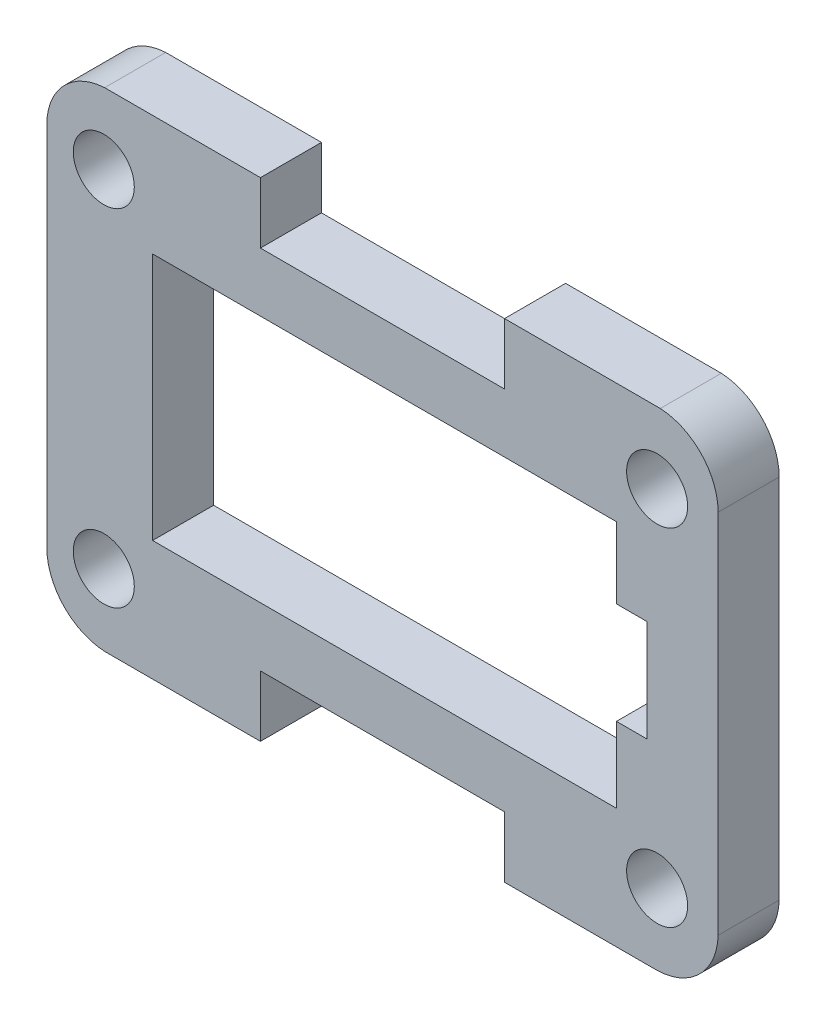
ISO-10303-21;
HEADER;
FILE_DESCRIPTION(('STEP AP214'),'2;1');
FILE_NAME('part.step','',(''),(''),'','','');
FILE_SCHEMA(('AUTOMOTIVE_DESIGN { 1 0 10303 214 1 1 1 1 }'));
ENDSEC;
DATA;
#1=APPLICATION_CONTEXT('core data for automotive mechanical design processes');
#2=APPLICATION_PROTOCOL_DEFINITION('international standard','automotive_design',2000,#1);
#3=PRODUCT_CONTEXT('',#1,'mechanical');
#4=PRODUCT('Part','Part','',(#3));
#5=PRODUCT_RELATED_PRODUCT_CATEGORY('part','',(#4));
#6=PRODUCT_DEFINITION_FORMATION('','',#4);
#7=PRODUCT_DEFINITION_CONTEXT('part definition',#1,'design');
#8=PRODUCT_DEFINITION('design','',#6,#7);
#9=PRODUCT_DEFINITION_SHAPE('','',#8);
#10=(LENGTH_UNIT() NAMED_UNIT(*) SI_UNIT(.MILLI.,.METRE.));
#11=(NAMED_UNIT(*) PLANE_ANGLE_UNIT() SI_UNIT($,.RADIAN.));
#12=(NAMED_UNIT(*) SI_UNIT($,.STERADIAN.) SOLID_ANGLE_UNIT());
#13=UNCERTAINTY_MEASURE_WITH_UNIT(LENGTH_MEASURE(1.E-05),#10,'distance_accuracy_value','');
#14=(GEOMETRIC_REPRESENTATION_CONTEXT(3) GLOBAL_UNCERTAINTY_ASSIGNED_CONTEXT((#13)) GLOBAL_UNIT_ASSIGNED_CONTEXT((#10,
#11,#12)) REPRESENTATION_CONTEXT('',''));
#15=CARTESIAN_POINT('',(0.,0.,0.));
#16=DIRECTION('',(0.,0.,1.));
#17=DIRECTION('',(1.,0.,0.));
#18=AXIS2_PLACEMENT_3D('',#15,#16,#17);
#19=CARTESIAN_POINT('',(207.000237796486,84.9905567618648,3.));
#20=DIRECTION('',(0.,0.,1.));
#21=DIRECTION('',(1.,0.,0.));
#22=AXIS2_PLACEMENT_3D('',#19,#20,#21);
#23=PLANE('',#22);
#24=CARTESIAN_POINT('',(207.000112679908,84.4865165778574,3.));
#25=DIRECTION('',(0.,0.,1.));
#26=DIRECTION('',(1.,0.,0.));
#27=AXIS2_PLACEMENT_3D('',#24,#25,#26);
#28=CIRCLE('',#27,1.50000000833417);
#29=CARTESIAN_POINT('',(208.500112688243,84.4865165778574,3.));
#30=VERTEX_POINT('',#29);
#31=EDGE_CURVE('E722',#30,#30,#28,.T.);
#32=ORIENTED_EDGE('',*,*,#31,.F.);
#33=EDGE_LOOP('',(#32));
#34=FACE_BOUND('',#33,.T.);
#35=CARTESIAN_POINT('',(179.800012686101,67.4865165678567,3.));
#36=DIRECTION('',(0.,0.,1.));
#37=DIRECTION('',(1.,0.,0.));
#38=AXIS2_PLACEMENT_3D('',#35,#36,#37);
#39=CIRCLE('',#38,1.50000000166674);
#40=CARTESIAN_POINT('',(181.300012687767,67.4865165678567,3.));
#41=VERTEX_POINT('',#40);
#42=EDGE_CURVE('E232',#41,#41,#39,.T.);
#43=ORIENTED_EDGE('',*,*,#42,.F.);
#44=EDGE_LOOP('',(#43));
#45=FACE_BOUND('',#44,.T.);
#46=DIRECTION('',(-1.,0.,0.));
#47=VECTOR('',#46,1.);
#48=CARTESIAN_POINT('',(199.500112684434,87.9863165695235,3.));
#49=LINE('',#48,#47);
#50=CARTESIAN_POINT('',(207.157312684549,87.9863165695236,3.));
#51=VERTEX_POINT('',#50);
#52=CARTESIAN_POINT('',(199.500112684434,87.9863165695235,3.));
#53=VERTEX_POINT('',#52);
#54=EDGE_CURVE('E262',#51,#53,#49,.T.);
#55=ORIENTED_EDGE('',*,*,#54,.T.);
#56=DIRECTION('',(0.,-1.,0.));
#57=VECTOR('',#56,1.);
#58=CARTESIAN_POINT('',(199.500112684434,87.9863165695235,3.));
#59=LINE('',#58,#57);
#60=CARTESIAN_POINT('',(199.500112684434,84.9865165695234,3.));
#61=VERTEX_POINT('',#60);
#62=EDGE_CURVE('E265',#53,#61,#59,.T.);
#63=ORIENTED_EDGE('',*,*,#62,.T.);
#64=DIRECTION('',(-1.,0.,0.));
#65=VECTOR('',#64,1.);
#66=CARTESIAN_POINT('',(199.500112684434,84.9865165695234,3.));
#67=LINE('',#66,#65);
#68=CARTESIAN_POINT('',(187.500112684433,84.9865165695234,3.));
#69=VERTEX_POINT('',#68);
#70=EDGE_CURVE('E268',#61,#69,#67,.T.);
#71=ORIENTED_EDGE('',*,*,#70,.T.);
#72=DIRECTION('',(0.,1.,0.));
#73=VECTOR('',#72,1.);
#74=CARTESIAN_POINT('',(187.500112684433,84.9865165695234,3.));
#75=LINE('',#74,#73);
#76=CARTESIAN_POINT('',(187.500112684433,87.9863165695235,3.));
#77=VERTEX_POINT('',#76);
#78=EDGE_CURVE('E270',#69,#77,#75,.T.);
#79=ORIENTED_EDGE('',*,*,#78,.T.);
#80=DIRECTION('',(-1.,0.,0.));
#81=VECTOR('',#80,1.);
#82=CARTESIAN_POINT('',(187.500112684433,87.9863165695235,3.));
#83=LINE('',#82,#81);
#84=CARTESIAN_POINT('',(179.842912684433,87.9863165695236,3.));
#85=VERTEX_POINT('',#84);
#86=EDGE_CURVE('E272',#77,#85,#83,.T.);
#87=ORIENTED_EDGE('',*,*,#86,.T.);
#88=CARTESIAN_POINT('',(179.999987572496,84.9905567618648,3.));
#89=DIRECTION('',(0.,0.,1.));
#90=DIRECTION('',(1.,0.,0.));
#91=AXIS2_PLACEMENT_3D('',#88,#89,#90);
#92=CIRCLE('',#91,2.99987488833178);
#93=CARTESIAN_POINT('',(177.000112684434,84.9905165695236,3.));
#94=VERTEX_POINT('',#93);
#95=EDGE_CURVE('E274',#85,#94,#92,.T.);
#96=ORIENTED_EDGE('',*,*,#95,.T.);
#97=DIRECTION('',(0.,-1.,0.));
#98=VECTOR('',#97,1.);
#99=CARTESIAN_POINT('',(177.000112684434,66.9823165695233,3.));
#100=LINE('',#99,#98);
#101=CARTESIAN_POINT('',(177.000112684434,66.9823165695233,3.));
#102=VERTEX_POINT('',#101);
#103=EDGE_CURVE('E276',#94,#102,#100,.T.);
#104=ORIENTED_EDGE('',*,*,#103,.T.);
#105=CARTESIAN_POINT('',(179.999987572497,66.9822763771822,3.));
#106=DIRECTION('',(0.,0.,1.));
#107=DIRECTION('',(1.,0.,0.));
#108=AXIS2_PLACEMENT_3D('',#105,#106,#107);
#109=CIRCLE('',#108,2.99987488833185);
#110=CARTESIAN_POINT('',(179.842912684434,63.9865165695234,3.));
#111=VERTEX_POINT('',#110);
#112=EDGE_CURVE('E278',#102,#111,#109,.T.);
#113=ORIENTED_EDGE('',*,*,#112,.T.);
#114=DIRECTION('',(1.,0.,0.));
#115=VECTOR('',#114,1.);
#116=CARTESIAN_POINT('',(187.500112684433,63.9865165695234,3.));
#117=LINE('',#116,#115);
#118=CARTESIAN_POINT('',(187.500112684433,63.9865165695234,3.));
#119=VERTEX_POINT('',#118);
#120=EDGE_CURVE('E280',#111,#119,#117,.T.);
#121=ORIENTED_EDGE('',*,*,#120,.T.);
#122=DIRECTION('',(0.,1.,0.));
#123=VECTOR('',#122,1.);
#124=CARTESIAN_POINT('',(187.500112684433,66.9865165695235,3.));
#125=LINE('',#124,#123);
#126=CARTESIAN_POINT('',(187.500112684433,66.9865165695235,3.));
#127=VERTEX_POINT('',#126);
#128=EDGE_CURVE('E282',#119,#127,#125,.T.);
#129=ORIENTED_EDGE('',*,*,#128,.T.);
#130=DIRECTION('',(1.,0.,0.));
#131=VECTOR('',#130,1.);
#132=CARTESIAN_POINT('',(199.500112684434,66.9865165695235,3.));
#133=LINE('',#132,#131);
#134=CARTESIAN_POINT('',(199.500112684434,66.9865165695235,3.));
#135=VERTEX_POINT('',#134);
#136=EDGE_CURVE('E284',#127,#135,#133,.T.);
#137=ORIENTED_EDGE('',*,*,#136,.T.);
#138=DIRECTION('',(1.66533453693769E-13,-1.,0.));
#139=VECTOR('',#138,1.);
#140=CARTESIAN_POINT('',(199.500112684434,63.9865165695234,3.));
#141=LINE('',#140,#139);
#142=CARTESIAN_POINT('',(199.500112684434,63.9865165695234,3.));
#143=VERTEX_POINT('',#142);
#144=EDGE_CURVE('E286',#135,#143,#141,.T.);
#145=ORIENTED_EDGE('',*,*,#144,.T.);
#146=DIRECTION('',(1.,0.,0.));
#147=VECTOR('',#146,1.);
#148=CARTESIAN_POINT('',(199.500112684434,63.9865165695234,3.));
#149=LINE('',#148,#147);
#150=CARTESIAN_POINT('',(207.000112684425,63.9865165695234,3.));
#151=VERTEX_POINT('',#150);
#152=EDGE_CURVE('E288',#143,#151,#149,.T.);
#153=ORIENTED_EDGE('',*,*,#152,.T.);
#154=CARTESIAN_POINT('',(206.921637796367,67.065104420582,3.));
#155=DIRECTION('',(0.,0.,1.));
#156=DIRECTION('',(1.,0.,0.));
#157=AXIS2_PLACEMENT_3D('',#154,#155,#156);
#158=CIRCLE('',#157,3.07958787254749);
#159=CARTESIAN_POINT('',(210.000112684434,66.9823165695234,3.));
#160=VERTEX_POINT('',#159);
#161=EDGE_CURVE('E290',#151,#160,#158,.T.);
#162=ORIENTED_EDGE('',*,*,#161,.T.);
#163=DIRECTION('',(6.36854535399307E-12,1.,0.));
#164=VECTOR('',#163,1.);
#165=CARTESIAN_POINT('',(210.000112684549,84.9905165695235,3.));
#166=LINE('',#165,#164);
#167=CARTESIAN_POINT('',(210.000112684549,84.9905165695235,3.));
#168=VERTEX_POINT('',#167);
#169=EDGE_CURVE('E292',#160,#168,#166,.T.);
#170=ORIENTED_EDGE('',*,*,#169,.T.);
#171=CARTESIAN_POINT('',(207.000237796486,84.9905567618648,3.));
#172=DIRECTION('',(0.,0.,1.));
#173=DIRECTION('',(1.,0.,0.));
#174=AXIS2_PLACEMENT_3D('',#171,#172,#173);
#175=CIRCLE('',#174,2.99987488833178);
#176=EDGE_CURVE('E294',#168,#51,#175,.T.);
#177=ORIENTED_EDGE('',*,*,#176,.T.);
#178=EDGE_LOOP('',(#55,#63,#71,#79,#87,#96,#104,#113,#121,#129,#137,#145,#153,#162,#170,#177));
#179=FACE_BOUND('',#178,.T.);
#180=DIRECTION('',(0.,1.,0.));
#181=VECTOR('',#180,1.);
#182=CARTESIAN_POINT('',(206.500112684434,78.5885165779574,3.));
#183=LINE('',#182,#181);
#184=CARTESIAN_POINT('',(206.500112684434,73.5885165779573,3.));
#185=VERTEX_POINT('',#184);
#186=CARTESIAN_POINT('',(206.500112684434,78.5885165779574,3.));
#187=VERTEX_POINT('',#186);
#188=EDGE_CURVE('E202',#185,#187,#183,.T.);
#189=ORIENTED_EDGE('',*,*,#188,.F.);
#190=DIRECTION('',(1.,0.,0.));
#191=VECTOR('',#190,1.);
#192=CARTESIAN_POINT('',(206.500112684434,73.5885165779573,3.));
#193=LINE('',#192,#191);
#194=CARTESIAN_POINT('',(205.000112684434,73.5885165779573,3.));
#195=VERTEX_POINT('',#194);
#196=EDGE_CURVE('E194',#195,#185,#193,.T.);
#197=ORIENTED_EDGE('',*,*,#196,.F.);
#198=DIRECTION('',(0.,1.,0.));
#199=VECTOR('',#198,1.);
#200=CARTESIAN_POINT('',(205.000112684434,73.5885165779573,3.));
#201=LINE('',#200,#199);
#202=CARTESIAN_POINT('',(205.000112684434,69.8885165779574,3.));
#203=VERTEX_POINT('',#202);
#204=EDGE_CURVE('E229',#203,#195,#201,.T.);
#205=ORIENTED_EDGE('',*,*,#204,.F.);
#206=DIRECTION('',(1.,0.,0.));
#207=VECTOR('',#206,1.);
#208=CARTESIAN_POINT('',(205.000112684434,69.8885165779574,3.));
#209=LINE('',#208,#207);
#210=CARTESIAN_POINT('',(182.200112684433,69.8885165779574,3.));
#211=VERTEX_POINT('',#210);
#212=EDGE_CURVE('E227',#211,#203,#209,.T.);
#213=ORIENTED_EDGE('',*,*,#212,.F.);
#214=DIRECTION('',(0.,-1.,0.));
#215=VECTOR('',#214,1.);
#216=CARTESIAN_POINT('',(182.200112684433,69.8885165779574,3.));
#217=LINE('',#216,#215);
#218=CARTESIAN_POINT('',(182.200112684433,82.0885165779572,3.));
#219=VERTEX_POINT('',#218);
#220=EDGE_CURVE('E225',#219,#211,#217,.T.);
#221=ORIENTED_EDGE('',*,*,#220,.F.);
#222=DIRECTION('',(-1.,0.,0.));
#223=VECTOR('',#222,1.);
#224=CARTESIAN_POINT('',(182.200112684433,82.0885165779572,3.));
#225=LINE('',#224,#223);
#226=CARTESIAN_POINT('',(205.000112684434,82.0885165779572,3.));
#227=VERTEX_POINT('',#226);
#228=EDGE_CURVE('E223',#227,#219,#225,.T.);
#229=ORIENTED_EDGE('',*,*,#228,.F.);
#230=DIRECTION('',(0.,1.,0.));
#231=VECTOR('',#230,1.);
#232=CARTESIAN_POINT('',(205.000112684434,82.0885165779572,3.));
#233=LINE('',#232,#231);
#234=CARTESIAN_POINT('',(205.000112684434,78.5885165779574,3.));
#235=VERTEX_POINT('',#234);
#236=EDGE_CURVE('E218',#235,#227,#233,.T.);
#237=ORIENTED_EDGE('',*,*,#236,.F.);
#238=DIRECTION('',(-1.,0.,0.));
#239=VECTOR('',#238,1.);
#240=CARTESIAN_POINT('',(205.000112684434,78.5885165779574,3.));
#241=LINE('',#240,#239);
#242=EDGE_CURVE('E216',#187,#235,#241,.T.);
#243=ORIENTED_EDGE('',*,*,#242,.F.);
#244=EDGE_LOOP('',(#189,#197,#205,#213,#221,#229,#237,#243));
#245=FACE_BOUND('',#244,.T.);
#246=CARTESIAN_POINT('',(179.800062677767,84.4865665828579,3.));
#247=DIRECTION('',(0.,0.,1.));
#248=DIRECTION('',(1.,0.,0.));
#249=AXIS2_PLACEMENT_3D('',#246,#247,#248);
#250=CIRCLE('',#249,1.50000000000003);
#251=CARTESIAN_POINT('',(181.300062677767,84.4865665828579,3.));
#252=VERTEX_POINT('',#251);
#253=EDGE_CURVE('E728',#252,#252,#250,.T.);
#254=ORIENTED_EDGE('',*,*,#253,.F.);
#255=EDGE_LOOP('',(#254));
#256=FACE_BOUND('',#255,.T.);
#257=CARTESIAN_POINT('',(207.000062687767,67.4864665728567,3.));
#258=DIRECTION('',(0.,0.,1.));
#259=DIRECTION('',(1.,0.,0.));
#260=AXIS2_PLACEMENT_3D('',#257,#258,#259);
#261=CIRCLE('',#260,1.5);
#262=CARTESIAN_POINT('',(208.500062687767,67.4864665728567,3.));
#263=VERTEX_POINT('',#262);
#264=EDGE_CURVE('E713',#263,#263,#261,.T.);
#265=ORIENTED_EDGE('',*,*,#264,.F.);
#266=EDGE_LOOP('',(#265));
#267=FACE_BOUND('',#266,.T.);
#268=ADVANCED_FACE('F33',(#34,#45,#179,#245,#256,#267),#23,.T.);
#269=CARTESIAN_POINT('',(207.000237796486,84.9905567618648,0.));
#270=DIRECTION('',(0.,0.,1.));
#271=DIRECTION('',(1.,0.,0.));
#272=AXIS2_PLACEMENT_3D('',#269,#270,#271);
#273=PLANE('',#272);
#274=DIRECTION('',(-1.,0.,0.));
#275=VECTOR('',#274,1.);
#276=CARTESIAN_POINT('',(199.500112684434,87.9863165695235,0.));
#277=LINE('',#276,#275);
#278=CARTESIAN_POINT('',(207.157312684549,87.9863165695236,0.));
#279=VERTEX_POINT('',#278);
#280=CARTESIAN_POINT('',(199.500112684434,87.9863165695235,0.));
#281=VERTEX_POINT('',#280);
#282=EDGE_CURVE('E210',#279,#281,#277,.T.);
#283=ORIENTED_EDGE('',*,*,#282,.F.);
#284=CARTESIAN_POINT('',(207.000237796486,84.9905567618648,0.));
#285=DIRECTION('',(0.,0.,1.));
#286=DIRECTION('',(1.,0.,0.));
#287=AXIS2_PLACEMENT_3D('',#284,#285,#286);
#288=CIRCLE('',#287,2.99987488833178);
#289=CARTESIAN_POINT('',(210.000112684549,84.9905165695235,0.));
#290=VERTEX_POINT('',#289);
#291=EDGE_CURVE('E266',#290,#279,#288,.T.);
#292=ORIENTED_EDGE('',*,*,#291,.F.);
#293=DIRECTION('',(6.36854535399307E-12,1.,0.));
#294=VECTOR('',#293,1.);
#295=CARTESIAN_POINT('',(210.000112684549,84.9905165695235,0.));
#296=LINE('',#295,#294);
#297=CARTESIAN_POINT('',(210.000112684434,66.9823165695234,0.));
#298=VERTEX_POINT('',#297);
#299=EDGE_CURVE('E325',#298,#290,#296,.T.);
#300=ORIENTED_EDGE('',*,*,#299,.F.);
#301=CARTESIAN_POINT('',(206.921637796367,67.065104420582,0.));
#302=DIRECTION('',(0.,0.,1.));
#303=DIRECTION('',(1.,0.,0.));
#304=AXIS2_PLACEMENT_3D('',#301,#302,#303);
#305=CIRCLE('',#304,3.07958787254749);
#306=CARTESIAN_POINT('',(207.000112684425,63.9865165695234,0.));
#307=VERTEX_POINT('',#306);
#308=EDGE_CURVE('E323',#307,#298,#305,.T.);
#309=ORIENTED_EDGE('',*,*,#308,.F.);
#310=DIRECTION('',(1.,0.,0.));
#311=VECTOR('',#310,1.);
#312=CARTESIAN_POINT('',(199.500112684434,63.9865165695234,0.));
#313=LINE('',#312,#311);
#314=CARTESIAN_POINT('',(199.500112684434,63.9865165695234,0.));
#315=VERTEX_POINT('',#314);
#316=EDGE_CURVE('E321',#315,#307,#313,.T.);
#317=ORIENTED_EDGE('',*,*,#316,.F.);
#318=DIRECTION('',(1.66533453693769E-13,-1.,0.));
#319=VECTOR('',#318,1.);
#320=CARTESIAN_POINT('',(199.500112684434,63.9865165695234,0.));
#321=LINE('',#320,#319);
#322=CARTESIAN_POINT('',(199.500112684434,66.9865165695235,0.));
#323=VERTEX_POINT('',#322);
#324=EDGE_CURVE('E319',#323,#315,#321,.T.);
#325=ORIENTED_EDGE('',*,*,#324,.F.);
#326=DIRECTION('',(1.,0.,0.));
#327=VECTOR('',#326,1.);
#328=CARTESIAN_POINT('',(199.500112684434,66.9865165695235,0.));
#329=LINE('',#328,#327);
#330=CARTESIAN_POINT('',(187.500112684433,66.9865165695235,0.));
#331=VERTEX_POINT('',#330);
#332=EDGE_CURVE('E317',#331,#323,#329,.T.);
#333=ORIENTED_EDGE('',*,*,#332,.F.);
#334=DIRECTION('',(0.,1.,0.));
#335=VECTOR('',#334,1.);
#336=CARTESIAN_POINT('',(187.500112684433,66.9865165695235,0.));
#337=LINE('',#336,#335);
#338=CARTESIAN_POINT('',(187.500112684433,63.9865165695234,0.));
#339=VERTEX_POINT('',#338);
#340=EDGE_CURVE('E315',#339,#331,#337,.T.);
#341=ORIENTED_EDGE('',*,*,#340,.F.);
#342=DIRECTION('',(1.,0.,0.));
#343=VECTOR('',#342,1.);
#344=CARTESIAN_POINT('',(187.500112684433,63.9865165695234,0.));
#345=LINE('',#344,#343);
#346=CARTESIAN_POINT('',(179.842912684434,63.9865165695234,0.));
#347=VERTEX_POINT('',#346);
#348=EDGE_CURVE('E313',#347,#339,#345,.T.);
#349=ORIENTED_EDGE('',*,*,#348,.F.);
#350=CARTESIAN_POINT('',(179.999987572497,66.9822763771822,0.));
#351=DIRECTION('',(0.,0.,1.));
#352=DIRECTION('',(1.,0.,0.));
#353=AXIS2_PLACEMENT_3D('',#350,#351,#352);
#354=CIRCLE('',#353,2.99987488833185);
#355=CARTESIAN_POINT('',(177.000112684434,66.9823165695233,0.));
#356=VERTEX_POINT('',#355);
#357=EDGE_CURVE('E311',#356,#347,#354,.T.);
#358=ORIENTED_EDGE('',*,*,#357,.F.);
#359=DIRECTION('',(0.,-1.,0.));
#360=VECTOR('',#359,1.);
#361=CARTESIAN_POINT('',(177.000112684434,66.9823165695233,0.));
#362=LINE('',#361,#360);
#363=CARTESIAN_POINT('',(177.000112684434,84.9905165695236,0.));
#364=VERTEX_POINT('',#363);
#365=EDGE_CURVE('E309',#364,#356,#362,.T.);
#366=ORIENTED_EDGE('',*,*,#365,.F.);
#367=CARTESIAN_POINT('',(179.999987572496,84.9905567618648,0.));
#368=DIRECTION('',(0.,0.,1.));
#369=DIRECTION('',(1.,0.,0.));
#370=AXIS2_PLACEMENT_3D('',#367,#368,#369);
#371=CIRCLE('',#370,2.99987488833178);
#372=CARTESIAN_POINT('',(179.842912684433,87.9863165695236,0.));
#373=VERTEX_POINT('',#372);
#374=EDGE_CURVE('E307',#373,#364,#371,.T.);
#375=ORIENTED_EDGE('',*,*,#374,.F.);
#376=DIRECTION('',(-1.,0.,0.));
#377=VECTOR('',#376,1.);
#378=CARTESIAN_POINT('',(187.500112684433,87.9863165695235,0.));
#379=LINE('',#378,#377);
#380=CARTESIAN_POINT('',(187.500112684433,87.9863165695235,0.));
#381=VERTEX_POINT('',#380);
#382=EDGE_CURVE('E305',#381,#373,#379,.T.);
#383=ORIENTED_EDGE('',*,*,#382,.F.);
#384=DIRECTION('',(0.,1.,0.));
#385=VECTOR('',#384,1.);
#386=CARTESIAN_POINT('',(187.500112684433,84.9865165695234,0.));
#387=LINE('',#386,#385);
#388=CARTESIAN_POINT('',(187.500112684433,84.9865165695234,0.));
#389=VERTEX_POINT('',#388);
#390=EDGE_CURVE('E303',#389,#381,#387,.T.);
#391=ORIENTED_EDGE('',*,*,#390,.F.);
#392=DIRECTION('',(-1.,0.,0.));
#393=VECTOR('',#392,1.);
#394=CARTESIAN_POINT('',(199.500112684434,84.9865165695234,0.));
#395=LINE('',#394,#393);
#396=CARTESIAN_POINT('',(199.500112684434,84.9865165695234,0.));
#397=VERTEX_POINT('',#396);
#398=EDGE_CURVE('E301',#397,#389,#395,.T.);
#399=ORIENTED_EDGE('',*,*,#398,.F.);
#400=DIRECTION('',(0.,-1.,0.));
#401=VECTOR('',#400,1.);
#402=CARTESIAN_POINT('',(199.500112684434,87.9863165695235,0.));
#403=LINE('',#402,#401);
#404=EDGE_CURVE('E299',#281,#397,#403,.T.);
#405=ORIENTED_EDGE('',*,*,#404,.F.);
#406=EDGE_LOOP('',(#283,#292,#300,#309,#317,#325,#333,#341,#349,#358,#366,#375,#383,#391,#399,#405));
#407=FACE_BOUND('',#406,.T.);
#408=DIRECTION('',(1.,0.,0.));
#409=VECTOR('',#408,1.);
#410=CARTESIAN_POINT('',(206.500112684434,73.5885165779573,0.));
#411=LINE('',#410,#409);
#412=CARTESIAN_POINT('',(205.000112684434,73.5885165779573,0.));
#413=VERTEX_POINT('',#412);
#414=CARTESIAN_POINT('',(206.500112684434,73.5885165779573,0.));
#415=VERTEX_POINT('',#414);
#416=EDGE_CURVE('E56',#413,#415,#411,.T.);
#417=ORIENTED_EDGE('',*,*,#416,.T.);
#418=DIRECTION('',(0.,1.,0.));
#419=VECTOR('',#418,1.);
#420=CARTESIAN_POINT('',(206.500112684434,78.5885165779574,0.));
#421=LINE('',#420,#419);
#422=CARTESIAN_POINT('',(206.500112684434,78.5885165779574,0.));
#423=VERTEX_POINT('',#422);
#424=EDGE_CURVE('E209',#415,#423,#421,.T.);
#425=ORIENTED_EDGE('',*,*,#424,.T.);
#426=DIRECTION('',(-1.,0.,0.));
#427=VECTOR('',#426,1.);
#428=CARTESIAN_POINT('',(205.000112684434,78.5885165779574,0.));
#429=LINE('',#428,#427);
#430=CARTESIAN_POINT('',(205.000112684434,78.5885165779574,0.));
#431=VERTEX_POINT('',#430);
#432=EDGE_CURVE('E234',#423,#431,#429,.T.);
#433=ORIENTED_EDGE('',*,*,#432,.T.);
#434=DIRECTION('',(0.,1.,0.));
#435=VECTOR('',#434,1.);
#436=CARTESIAN_POINT('',(205.000112684434,82.0885165779572,0.));
#437=LINE('',#436,#435);
#438=CARTESIAN_POINT('',(205.000112684434,82.0885165779572,0.));
#439=VERTEX_POINT('',#438);
#440=EDGE_CURVE('E237',#431,#439,#437,.T.);
#441=ORIENTED_EDGE('',*,*,#440,.T.);
#442=DIRECTION('',(-1.,0.,0.));
#443=VECTOR('',#442,1.);
#444=CARTESIAN_POINT('',(182.200112684433,82.0885165779572,0.));
#445=LINE('',#444,#443);
#446=CARTESIAN_POINT('',(182.200112684433,82.0885165779572,0.));
#447=VERTEX_POINT('',#446);
#448=EDGE_CURVE('E240',#439,#447,#445,.T.);
#449=ORIENTED_EDGE('',*,*,#448,.T.);
#450=DIRECTION('',(0.,-1.,0.));
#451=VECTOR('',#450,1.);
#452=CARTESIAN_POINT('',(182.200112684433,69.8885165779574,0.));
#453=LINE('',#452,#451);
#454=CARTESIAN_POINT('',(182.200112684433,69.8885165779574,0.));
#455=VERTEX_POINT('',#454);
#456=EDGE_CURVE('E243',#447,#455,#453,.T.);
#457=ORIENTED_EDGE('',*,*,#456,.T.);
#458=DIRECTION('',(1.,0.,0.));
#459=VECTOR('',#458,1.);
#460=CARTESIAN_POINT('',(205.000112684434,69.8885165779574,0.));
#461=LINE('',#460,#459);
#462=CARTESIAN_POINT('',(205.000112684434,69.8885165779574,0.));
#463=VERTEX_POINT('',#462);
#464=EDGE_CURVE('E246',#455,#463,#461,.T.);
#465=ORIENTED_EDGE('',*,*,#464,.T.);
#466=DIRECTION('',(0.,1.,0.));
#467=VECTOR('',#466,1.);
#468=CARTESIAN_POINT('',(205.000112684434,73.5885165779573,0.));
#469=LINE('',#468,#467);
#470=EDGE_CURVE('E203',#463,#413,#469,.T.);
#471=ORIENTED_EDGE('',*,*,#470,.T.);
#472=EDGE_LOOP('',(#417,#425,#433,#441,#449,#457,#465,#471));
#473=FACE_BOUND('',#472,.T.);
#474=CARTESIAN_POINT('',(179.800012686101,67.4865165678567,0.));
#475=DIRECTION('',(0.,0.,1.));
#476=DIRECTION('',(1.,0.,0.));
#477=AXIS2_PLACEMENT_3D('',#474,#475,#476);
#478=CIRCLE('',#477,1.50000000166674);
#479=CARTESIAN_POINT('',(181.300012687767,67.4865165678567,0.));
#480=VERTEX_POINT('',#479);
#481=EDGE_CURVE('E731',#480,#480,#478,.T.);
#482=ORIENTED_EDGE('',*,*,#481,.T.);
#483=EDGE_LOOP('',(#482));
#484=FACE_BOUND('',#483,.T.);
#485=CARTESIAN_POINT('',(179.800062677767,84.4865665828579,0.));
#486=DIRECTION('',(0.,0.,1.));
#487=DIRECTION('',(1.,0.,0.));
#488=AXIS2_PLACEMENT_3D('',#485,#486,#487);
#489=CIRCLE('',#488,1.50000000000003);
#490=CARTESIAN_POINT('',(181.300062677767,84.4865665828579,0.));
#491=VERTEX_POINT('',#490);
#492=EDGE_CURVE('E725',#491,#491,#489,.T.);
#493=ORIENTED_EDGE('',*,*,#492,.T.);
#494=EDGE_LOOP('',(#493));
#495=FACE_BOUND('',#494,.T.);
#496=CARTESIAN_POINT('',(207.000112679908,84.4865165778574,0.));
#497=DIRECTION('',(0.,0.,1.));
#498=DIRECTION('',(1.,0.,0.));
#499=AXIS2_PLACEMENT_3D('',#496,#497,#498);
#500=CIRCLE('',#499,1.50000000833417);
#501=CARTESIAN_POINT('',(208.500112688243,84.4865165778574,0.));
#502=VERTEX_POINT('',#501);
#503=EDGE_CURVE('E719',#502,#502,#500,.T.);
#504=ORIENTED_EDGE('',*,*,#503,.T.);
#505=EDGE_LOOP('',(#504));
#506=FACE_BOUND('',#505,.T.);
#507=CARTESIAN_POINT('',(207.000062687767,67.4864665728567,0.));
#508=DIRECTION('',(0.,0.,1.));
#509=DIRECTION('',(1.,0.,0.));
#510=AXIS2_PLACEMENT_3D('',#507,#508,#509);
#511=CIRCLE('',#510,1.5);
#512=CARTESIAN_POINT('',(208.500062687767,67.4864665728567,0.));
#513=VERTEX_POINT('',#512);
#514=EDGE_CURVE('E716',#513,#513,#511,.T.);
#515=ORIENTED_EDGE('',*,*,#514,.T.);
#516=EDGE_LOOP('',(#515));
#517=FACE_BOUND('',#516,.T.);
#518=ADVANCED_FACE('F379',(#407,#473,#484,#495,#506,#517),#273,.F.);
#519=CARTESIAN_POINT('',(199.500112684434,87.9863165695235,3.));
#520=DIRECTION('',(0.,-1.,0.));
#521=DIRECTION('',(1.,0.,0.));
#522=AXIS2_PLACEMENT_3D('',#519,#520,#521);
#523=PLANE('',#522);
#524=ORIENTED_EDGE('',*,*,#282,.T.);
#525=DIRECTION('',(0.,0.,-1.));
#526=VECTOR('',#525,1.);
#527=CARTESIAN_POINT('',(199.500112684434,87.9863165695235,3.));
#528=LINE('',#527,#526);
#529=EDGE_CURVE('E11',#53,#281,#528,.T.);
#530=ORIENTED_EDGE('',*,*,#529,.F.);
#531=ORIENTED_EDGE('',*,*,#54,.F.);
#532=DIRECTION('',(0.,0.,-1.));
#533=VECTOR('',#532,1.);
#534=CARTESIAN_POINT('',(207.157312684549,87.9863165695236,3.));
#535=LINE('',#534,#533);
#536=EDGE_CURVE('E296',#51,#279,#535,.T.);
#537=ORIENTED_EDGE('',*,*,#536,.T.);
#538=EDGE_LOOP('',(#524,#530,#531,#537));
#539=FACE_BOUND('',#538,.T.);
#540=ADVANCED_FACE('F35',(#539),#523,.F.);
#541=CARTESIAN_POINT('',(199.500112684434,87.9863165695235,3.));
#542=DIRECTION('',(1.,0.,0.));
#543=DIRECTION('',(0.,0.,-1.));
#544=AXIS2_PLACEMENT_3D('',#541,#542,#543);
#545=PLANE('',#544);
#546=ORIENTED_EDGE('',*,*,#404,.T.);
#547=DIRECTION('',(0.,0.,-1.));
#548=VECTOR('',#547,1.);
#549=CARTESIAN_POINT('',(199.500112684434,84.9865165695234,3.));
#550=LINE('',#549,#548);
#551=EDGE_CURVE('E41',#61,#397,#550,.T.);
#552=ORIENTED_EDGE('',*,*,#551,.F.);
#553=ORIENTED_EDGE('',*,*,#62,.F.);
#554=ORIENTED_EDGE('',*,*,#529,.T.);
#555=EDGE_LOOP('',(#546,#552,#553,#554));
#556=FACE_BOUND('',#555,.T.);
#557=ADVANCED_FACE('F396',(#556),#545,.F.);
#558=CARTESIAN_POINT('',(199.500112684434,84.9865165695234,3.));
#559=DIRECTION('',(0.,-1.,0.));
#560=DIRECTION('',(0.,0.,-1.));
#561=AXIS2_PLACEMENT_3D('',#558,#559,#560);
#562=PLANE('',#561);
#563=ORIENTED_EDGE('',*,*,#398,.T.);
#564=DIRECTION('',(0.,0.,-1.));
#565=VECTOR('',#564,1.);
#566=CARTESIAN_POINT('',(187.500112684433,84.9865165695234,3.));
#567=LINE('',#566,#565);
#568=EDGE_CURVE('E366',#69,#389,#567,.T.);
#569=ORIENTED_EDGE('',*,*,#568,.F.);
#570=ORIENTED_EDGE('',*,*,#70,.F.);
#571=ORIENTED_EDGE('',*,*,#551,.T.);
#572=EDGE_LOOP('',(#563,#569,#570,#571));
#573=FACE_BOUND('',#572,.T.);
#574=ADVANCED_FACE('F373',(#573),#562,.F.);
#575=CARTESIAN_POINT('',(187.500112684433,84.9865165695234,3.));
#576=DIRECTION('',(-1.,0.,0.));
#577=DIRECTION('',(0.,0.,1.));
#578=AXIS2_PLACEMENT_3D('',#575,#576,#577);
#579=PLANE('',#578);
#580=ORIENTED_EDGE('',*,*,#390,.T.);
#581=DIRECTION('',(0.,0.,-1.));
#582=VECTOR('',#581,1.);
#583=CARTESIAN_POINT('',(187.500112684433,87.9863165695235,3.));
#584=LINE('',#583,#582);
#585=EDGE_CURVE('E363',#77,#381,#584,.T.);
#586=ORIENTED_EDGE('',*,*,#585,.F.);
#587=ORIENTED_EDGE('',*,*,#78,.F.);
#588=ORIENTED_EDGE('',*,*,#568,.T.);
#589=EDGE_LOOP('',(#580,#586,#587,#588));
#590=FACE_BOUND('',#589,.T.);
#591=ADVANCED_FACE('F385',(#590),#579,.F.);
#592=CARTESIAN_POINT('',(187.500112684433,87.9863165695235,3.));
#593=DIRECTION('',(0.,-1.,0.));
#594=DIRECTION('',(1.,0.,0.));
#595=AXIS2_PLACEMENT_3D('',#592,#593,#594);
#596=PLANE('',#595);
#597=ORIENTED_EDGE('',*,*,#382,.T.);
#598=DIRECTION('',(0.,0.,-1.));
#599=VECTOR('',#598,1.);
#600=CARTESIAN_POINT('',(179.842912684433,87.9863165695236,3.));
#601=LINE('',#600,#599);
#602=EDGE_CURVE('E360',#85,#373,#601,.T.);
#603=ORIENTED_EDGE('',*,*,#602,.F.);
#604=ORIENTED_EDGE('',*,*,#86,.F.);
#605=ORIENTED_EDGE('',*,*,#585,.T.);
#606=EDGE_LOOP('',(#597,#603,#604,#605));
#607=FACE_BOUND('',#606,.T.);
#608=ADVANCED_FACE('F389',(#607),#596,.F.);
#609=CARTESIAN_POINT('',(179.999987572496,84.9905567618648,3.));
#610=DIRECTION('',(0.,0.,-1.));
#611=DIRECTION('',(-1.,0.,0.));
#612=AXIS2_PLACEMENT_3D('',#609,#610,#611);
#613=CYLINDRICAL_SURFACE('',#612,2.99987488833178);
#614=ORIENTED_EDGE('',*,*,#374,.T.);
#615=DIRECTION('',(0.,0.,-1.));
#616=VECTOR('',#615,1.);
#617=CARTESIAN_POINT('',(177.000112684434,84.9905165695236,3.));
#618=LINE('',#617,#616);
#619=EDGE_CURVE('E357',#94,#364,#618,.T.);
#620=ORIENTED_EDGE('',*,*,#619,.F.);
#621=ORIENTED_EDGE('',*,*,#95,.F.);
#622=ORIENTED_EDGE('',*,*,#602,.T.);
#623=EDGE_LOOP('',(#614,#620,#621,#622));
#624=FACE_BOUND('',#623,.T.);
#625=ADVANCED_FACE('F449',(#624),#613,.T.);
#626=CARTESIAN_POINT('',(177.000112684434,66.9823165695233,3.));
#627=DIRECTION('',(1.,0.,0.));
#628=DIRECTION('',(0.,0.,-1.));
#629=AXIS2_PLACEMENT_3D('',#626,#627,#628);
#630=PLANE('',#629);
#631=ORIENTED_EDGE('',*,*,#365,.T.);
#632=DIRECTION('',(0.,0.,-1.));
#633=VECTOR('',#632,1.);
#634=CARTESIAN_POINT('',(177.000112684434,66.9823165695233,3.));
#635=LINE('',#634,#633);
#636=EDGE_CURVE('E354',#102,#356,#635,.T.);
#637=ORIENTED_EDGE('',*,*,#636,.F.);
#638=ORIENTED_EDGE('',*,*,#103,.F.);
#639=ORIENTED_EDGE('',*,*,#619,.T.);
#640=EDGE_LOOP('',(#631,#637,#638,#639));
#641=FACE_BOUND('',#640,.T.);
#642=ADVANCED_FACE('F446',(#641),#630,.F.);
#643=CARTESIAN_POINT('',(179.999987572497,66.9822763771822,3.));
#644=DIRECTION('',(0.,0.,-1.));
#645=DIRECTION('',(-1.,0.,0.));
#646=AXIS2_PLACEMENT_3D('',#643,#644,#645);
#647=CYLINDRICAL_SURFACE('',#646,2.99987488833185);
#648=ORIENTED_EDGE('',*,*,#357,.T.);
#649=DIRECTION('',(0.,0.,-1.));
#650=VECTOR('',#649,1.);
#651=CARTESIAN_POINT('',(179.842912684434,63.9865165695234,3.));
#652=LINE('',#651,#650);
#653=EDGE_CURVE('E351',#111,#347,#652,.T.);
#654=ORIENTED_EDGE('',*,*,#653,.F.);
#655=ORIENTED_EDGE('',*,*,#112,.F.);
#656=ORIENTED_EDGE('',*,*,#636,.T.);
#657=EDGE_LOOP('',(#648,#654,#655,#656));
#658=FACE_BOUND('',#657,.T.);
#659=ADVANCED_FACE('F442',(#658),#647,.T.);
#660=CARTESIAN_POINT('',(187.500112684433,63.9865165695234,3.));
#661=DIRECTION('',(0.,1.,0.));
#662=DIRECTION('',(-1.,0.,0.));
#663=AXIS2_PLACEMENT_3D('',#660,#661,#662);
#664=PLANE('',#663);
#665=ORIENTED_EDGE('',*,*,#348,.T.);
#666=DIRECTION('',(0.,0.,-1.));
#667=VECTOR('',#666,1.);
#668=CARTESIAN_POINT('',(187.500112684433,63.9865165695234,3.));
#669=LINE('',#668,#667);
#670=EDGE_CURVE('E348',#119,#339,#669,.T.);
#671=ORIENTED_EDGE('',*,*,#670,.F.);
#672=ORIENTED_EDGE('',*,*,#120,.F.);
#673=ORIENTED_EDGE('',*,*,#653,.T.);
#674=EDGE_LOOP('',(#665,#671,#672,#673));
#675=FACE_BOUND('',#674,.T.);
#676=ADVANCED_FACE('F438',(#675),#664,.F.);
#677=CARTESIAN_POINT('',(187.500112684433,66.9865165695235,3.));
#678=DIRECTION('',(-1.,0.,0.));
#679=DIRECTION('',(0.,0.,1.));
#680=AXIS2_PLACEMENT_3D('',#677,#678,#679);
#681=PLANE('',#680);
#682=ORIENTED_EDGE('',*,*,#340,.T.);
#683=DIRECTION('',(0.,0.,-1.));
#684=VECTOR('',#683,1.);
#685=CARTESIAN_POINT('',(187.500112684433,66.9865165695235,3.));
#686=LINE('',#685,#684);
#687=EDGE_CURVE('E345',#127,#331,#686,.T.);
#688=ORIENTED_EDGE('',*,*,#687,.F.);
#689=ORIENTED_EDGE('',*,*,#128,.F.);
#690=ORIENTED_EDGE('',*,*,#670,.T.);
#691=EDGE_LOOP('',(#682,#688,#689,#690));
#692=FACE_BOUND('',#691,.T.);
#693=ADVANCED_FACE('F433',(#692),#681,.F.);
#694=CARTESIAN_POINT('',(199.500112684434,66.9865165695235,3.));
#695=DIRECTION('',(0.,1.,0.));
#696=DIRECTION('',(0.,0.,1.));
#697=AXIS2_PLACEMENT_3D('',#694,#695,#696);
#698=PLANE('',#697);
#699=ORIENTED_EDGE('',*,*,#332,.T.);
#700=DIRECTION('',(0.,0.,-1.));
#701=VECTOR('',#700,1.);
#702=CARTESIAN_POINT('',(199.500112684434,66.9865165695235,3.));
#703=LINE('',#702,#701);
#704=EDGE_CURVE('E342',#135,#323,#703,.T.);
#705=ORIENTED_EDGE('',*,*,#704,.F.);
#706=ORIENTED_EDGE('',*,*,#136,.F.);
#707=ORIENTED_EDGE('',*,*,#687,.T.);
#708=EDGE_LOOP('',(#699,#705,#706,#707));
#709=FACE_BOUND('',#708,.T.);
#710=ADVANCED_FACE('F427',(#709),#698,.F.);
#711=CARTESIAN_POINT('',(199.500112684434,63.9865165695234,3.));
#712=DIRECTION('',(1.,1.66533453693769E-13,0.));
#713=DIRECTION('',(-1.66533453693769E-13,1.,0.));
#714=AXIS2_PLACEMENT_3D('',#711,#712,#713);
#715=PLANE('',#714);
#716=ORIENTED_EDGE('',*,*,#324,.T.);
#717=DIRECTION('',(0.,0.,-1.));
#718=VECTOR('',#717,1.);
#719=CARTESIAN_POINT('',(199.500112684434,63.9865165695234,3.));
#720=LINE('',#719,#718);
#721=EDGE_CURVE('E339',#143,#315,#720,.T.);
#722=ORIENTED_EDGE('',*,*,#721,.F.);
#723=ORIENTED_EDGE('',*,*,#144,.F.);
#724=ORIENTED_EDGE('',*,*,#704,.T.);
#725=EDGE_LOOP('',(#716,#722,#723,#724));
#726=FACE_BOUND('',#725,.T.);
#727=ADVANCED_FACE('F423',(#726),#715,.F.);
#728=CARTESIAN_POINT('',(199.500112684434,63.9865165695234,3.));
#729=DIRECTION('',(0.,1.,0.));
#730=DIRECTION('',(-1.,0.,0.));
#731=AXIS2_PLACEMENT_3D('',#728,#729,#730);
#732=PLANE('',#731);
#733=ORIENTED_EDGE('',*,*,#316,.T.);
#734=DIRECTION('',(0.,0.,-1.));
#735=VECTOR('',#734,1.);
#736=CARTESIAN_POINT('',(207.000112684425,63.9865165695234,3.));
#737=LINE('',#736,#735);
#738=EDGE_CURVE('E336',#151,#307,#737,.T.);
#739=ORIENTED_EDGE('',*,*,#738,.F.);
#740=ORIENTED_EDGE('',*,*,#152,.F.);
#741=ORIENTED_EDGE('',*,*,#721,.T.);
#742=EDGE_LOOP('',(#733,#739,#740,#741));
#743=FACE_BOUND('',#742,.T.);
#744=ADVANCED_FACE('F418',(#743),#732,.F.);
#745=CARTESIAN_POINT('',(206.921637796367,67.065104420582,3.));
#746=DIRECTION('',(0.,0.,-1.));
#747=DIRECTION('',(-1.,0.,0.));
#748=AXIS2_PLACEMENT_3D('',#745,#746,#747);
#749=CYLINDRICAL_SURFACE('',#748,3.07958787254749);
#750=ORIENTED_EDGE('',*,*,#308,.T.);
#751=DIRECTION('',(0.,0.,-1.));
#752=VECTOR('',#751,1.);
#753=CARTESIAN_POINT('',(210.000112684434,66.9823165695234,3.));
#754=LINE('',#753,#752);
#755=EDGE_CURVE('E333',#160,#298,#754,.T.);
#756=ORIENTED_EDGE('',*,*,#755,.F.);
#757=ORIENTED_EDGE('',*,*,#161,.F.);
#758=ORIENTED_EDGE('',*,*,#738,.T.);
#759=EDGE_LOOP('',(#750,#756,#757,#758));
#760=FACE_BOUND('',#759,.T.);
#761=ADVANCED_FACE('F412',(#760),#749,.T.);
#762=CARTESIAN_POINT('',(210.000112684549,84.9905165695235,3.));
#763=DIRECTION('',(-1.,6.36854535399307E-12,0.));
#764=DIRECTION('',(-6.36854535399307E-12,-1.,0.));
#765=AXIS2_PLACEMENT_3D('',#762,#763,#764);
#766=PLANE('',#765);
#767=ORIENTED_EDGE('',*,*,#299,.T.);
#768=DIRECTION('',(0.,0.,-1.));
#769=VECTOR('',#768,1.);
#770=CARTESIAN_POINT('',(210.000112684549,84.9905165695235,3.));
#771=LINE('',#770,#769);
#772=EDGE_CURVE('E330',#168,#290,#771,.T.);
#773=ORIENTED_EDGE('',*,*,#772,.F.);
#774=ORIENTED_EDGE('',*,*,#169,.F.);
#775=ORIENTED_EDGE('',*,*,#755,.T.);
#776=EDGE_LOOP('',(#767,#773,#774,#775));
#777=FACE_BOUND('',#776,.T.);
#778=ADVANCED_FACE('F408',(#777),#766,.F.);
#779=CARTESIAN_POINT('',(207.000237796486,84.9905567618648,3.));
#780=DIRECTION('',(0.,0.,-1.));
#781=DIRECTION('',(-1.,0.,0.));
#782=AXIS2_PLACEMENT_3D('',#779,#780,#781);
#783=CYLINDRICAL_SURFACE('',#782,2.99987488833178);
#784=ORIENTED_EDGE('',*,*,#291,.T.);
#785=ORIENTED_EDGE('',*,*,#536,.F.);
#786=ORIENTED_EDGE('',*,*,#176,.F.);
#787=ORIENTED_EDGE('',*,*,#772,.T.);
#788=EDGE_LOOP('',(#784,#785,#786,#787));
#789=FACE_BOUND('',#788,.T.);
#790=ADVANCED_FACE('F403',(#789),#783,.T.);
#791=CARTESIAN_POINT('',(206.500112684434,73.5885165779573,3.));
#792=DIRECTION('',(0.,1.,0.));
#793=DIRECTION('',(0.,0.,1.));
#794=AXIS2_PLACEMENT_3D('',#791,#792,#793);
#795=PLANE('',#794);
#796=ORIENTED_EDGE('',*,*,#416,.F.);
#797=DIRECTION('',(0.,0.,-1.));
#798=VECTOR('',#797,1.);
#799=CARTESIAN_POINT('',(205.000112684434,73.5885165779573,3.));
#800=LINE('',#799,#798);
#801=EDGE_CURVE('E198',#195,#413,#800,.T.);
#802=ORIENTED_EDGE('',*,*,#801,.F.);
#803=ORIENTED_EDGE('',*,*,#196,.T.);
#804=DIRECTION('',(0.,0.,-1.));
#805=VECTOR('',#804,1.);
#806=CARTESIAN_POINT('',(206.500112684434,73.5885165779573,3.));
#807=LINE('',#806,#805);
#808=EDGE_CURVE('E197',#185,#415,#807,.T.);
#809=ORIENTED_EDGE('',*,*,#808,.T.);
#810=EDGE_LOOP('',(#796,#802,#803,#809));
#811=FACE_BOUND('',#810,.T.);
#812=ADVANCED_FACE('F196',(#811),#795,.T.);
#813=CARTESIAN_POINT('',(206.500112684434,78.5885165779574,3.));
#814=DIRECTION('',(-1.,0.,0.));
#815=DIRECTION('',(0.,-1.,0.));
#816=AXIS2_PLACEMENT_3D('',#813,#814,#815);
#817=PLANE('',#816);
#818=ORIENTED_EDGE('',*,*,#424,.F.);
#819=ORIENTED_EDGE('',*,*,#808,.F.);
#820=ORIENTED_EDGE('',*,*,#188,.T.);
#821=DIRECTION('',(0.,0.,-1.));
#822=VECTOR('',#821,1.);
#823=CARTESIAN_POINT('',(206.500112684434,78.5885165779574,3.));
#824=LINE('',#823,#822);
#825=EDGE_CURVE('E211',#187,#423,#824,.T.);
#826=ORIENTED_EDGE('',*,*,#825,.T.);
#827=EDGE_LOOP('',(#818,#819,#820,#826));
#828=FACE_BOUND('',#827,.T.);
#829=ADVANCED_FACE('F206',(#828),#817,.T.);
#830=CARTESIAN_POINT('',(205.000112684434,78.5885165779574,3.));
#831=DIRECTION('',(0.,-1.,0.));
#832=DIRECTION('',(0.,0.,-1.));
#833=AXIS2_PLACEMENT_3D('',#830,#831,#832);
#834=PLANE('',#833);
#835=ORIENTED_EDGE('',*,*,#432,.F.);
#836=ORIENTED_EDGE('',*,*,#825,.F.);
#837=ORIENTED_EDGE('',*,*,#242,.T.);
#838=DIRECTION('',(0.,0.,-1.));
#839=VECTOR('',#838,1.);
#840=CARTESIAN_POINT('',(205.000112684434,78.5885165779574,3.));
#841=LINE('',#840,#839);
#842=EDGE_CURVE('E259',#235,#431,#841,.T.);
#843=ORIENTED_EDGE('',*,*,#842,.T.);
#844=EDGE_LOOP('',(#835,#836,#837,#843));
#845=FACE_BOUND('',#844,.T.);
#846=ADVANCED_FACE('F534',(#845),#834,.T.);
#847=CARTESIAN_POINT('',(205.000112684434,82.0885165779572,3.));
#848=DIRECTION('',(-1.,0.,0.));
#849=DIRECTION('',(0.,0.,1.));
#850=AXIS2_PLACEMENT_3D('',#847,#848,#849);
#851=PLANE('',#850);
#852=ORIENTED_EDGE('',*,*,#440,.F.);
#853=ORIENTED_EDGE('',*,*,#842,.F.);
#854=ORIENTED_EDGE('',*,*,#236,.T.);
#855=DIRECTION('',(0.,0.,-1.));
#856=VECTOR('',#855,1.);
#857=CARTESIAN_POINT('',(205.000112684434,82.0885165779572,3.));
#858=LINE('',#857,#856);
#859=EDGE_CURVE('E257',#227,#439,#858,.T.);
#860=ORIENTED_EDGE('',*,*,#859,.T.);
#861=EDGE_LOOP('',(#852,#853,#854,#860));
#862=FACE_BOUND('',#861,.T.);
#863=ADVANCED_FACE('F540',(#862),#851,.T.);
#864=CARTESIAN_POINT('',(182.200112684433,82.0885165779572,3.));
#865=DIRECTION('',(0.,-1.,0.));
#866=DIRECTION('',(0.,0.,-1.));
#867=AXIS2_PLACEMENT_3D('',#864,#865,#866);
#868=PLANE('',#867);
#869=ORIENTED_EDGE('',*,*,#448,.F.);
#870=ORIENTED_EDGE('',*,*,#859,.F.);
#871=ORIENTED_EDGE('',*,*,#228,.T.);
#872=DIRECTION('',(0.,0.,-1.));
#873=VECTOR('',#872,1.);
#874=CARTESIAN_POINT('',(182.200112684433,82.0885165779572,3.));
#875=LINE('',#874,#873);
#876=EDGE_CURVE('E255',#219,#447,#875,.T.);
#877=ORIENTED_EDGE('',*,*,#876,.T.);
#878=EDGE_LOOP('',(#869,#870,#871,#877));
#879=FACE_BOUND('',#878,.T.);
#880=ADVANCED_FACE('F548',(#879),#868,.T.);
#881=CARTESIAN_POINT('',(182.200112684433,69.8885165779574,3.));
#882=DIRECTION('',(1.,0.,0.));
#883=DIRECTION('',(0.,0.,-1.));
#884=AXIS2_PLACEMENT_3D('',#881,#882,#883);
#885=PLANE('',#884);
#886=ORIENTED_EDGE('',*,*,#456,.F.);
#887=ORIENTED_EDGE('',*,*,#876,.F.);
#888=ORIENTED_EDGE('',*,*,#220,.T.);
#889=DIRECTION('',(0.,0.,-1.));
#890=VECTOR('',#889,1.);
#891=CARTESIAN_POINT('',(182.200112684433,69.8885165779574,3.));
#892=LINE('',#891,#890);
#893=EDGE_CURVE('E253',#211,#455,#892,.T.);
#894=ORIENTED_EDGE('',*,*,#893,.T.);
#895=EDGE_LOOP('',(#886,#887,#888,#894));
#896=FACE_BOUND('',#895,.T.);
#897=ADVANCED_FACE('F556',(#896),#885,.T.);
#898=CARTESIAN_POINT('',(205.000112684434,69.8885165779574,3.));
#899=DIRECTION('',(0.,1.,0.));
#900=DIRECTION('',(0.,0.,1.));
#901=AXIS2_PLACEMENT_3D('',#898,#899,#900);
#902=PLANE('',#901);
#903=ORIENTED_EDGE('',*,*,#464,.F.);
#904=ORIENTED_EDGE('',*,*,#893,.F.);
#905=ORIENTED_EDGE('',*,*,#212,.T.);
#906=DIRECTION('',(0.,0.,-1.));
#907=VECTOR('',#906,1.);
#908=CARTESIAN_POINT('',(205.000112684434,69.8885165779574,3.));
#909=LINE('',#908,#907);
#910=EDGE_CURVE('E48',#203,#463,#909,.T.);
#911=ORIENTED_EDGE('',*,*,#910,.T.);
#912=EDGE_LOOP('',(#903,#904,#905,#911));
#913=FACE_BOUND('',#912,.T.);
#914=ADVANCED_FACE('F564',(#913),#902,.T.);
#915=CARTESIAN_POINT('',(205.000112684434,73.5885165779573,3.));
#916=DIRECTION('',(-1.,0.,0.));
#917=DIRECTION('',(0.,0.,1.));
#918=AXIS2_PLACEMENT_3D('',#915,#916,#917);
#919=PLANE('',#918);
#920=ORIENTED_EDGE('',*,*,#470,.F.);
#921=ORIENTED_EDGE('',*,*,#910,.F.);
#922=ORIENTED_EDGE('',*,*,#204,.T.);
#923=ORIENTED_EDGE('',*,*,#801,.T.);
#924=EDGE_LOOP('',(#920,#921,#922,#923));
#925=FACE_BOUND('',#924,.T.);
#926=ADVANCED_FACE('F572',(#925),#919,.T.);
#927=CARTESIAN_POINT('',(179.800012686101,67.4865165678567,3.));
#928=DIRECTION('',(0.,0.,-1.));
#929=DIRECTION('',(-1.,0.,0.));
#930=AXIS2_PLACEMENT_3D('',#927,#928,#929);
#931=CYLINDRICAL_SURFACE('',#930,1.50000000166674);
#932=ORIENTED_EDGE('',*,*,#42,.T.);
#933=EDGE_LOOP('',(#932));
#934=FACE_BOUND('',#933,.T.);
#935=ORIENTED_EDGE('',*,*,#481,.F.);
#936=EDGE_LOOP('',(#935));
#937=FACE_BOUND('',#936,.T.);
#938=ADVANCED_FACE('F580',(#934,#937),#931,.F.);
#939=CARTESIAN_POINT('',(179.800062677767,84.4865665828579,3.));
#940=DIRECTION('',(0.,0.,-1.));
#941=DIRECTION('',(-1.,0.,0.));
#942=AXIS2_PLACEMENT_3D('',#939,#940,#941);
#943=CYLINDRICAL_SURFACE('',#942,1.50000000000003);
#944=ORIENTED_EDGE('',*,*,#253,.T.);
#945=EDGE_LOOP('',(#944));
#946=FACE_BOUND('',#945,.T.);
#947=ORIENTED_EDGE('',*,*,#492,.F.);
#948=EDGE_LOOP('',(#947));
#949=FACE_BOUND('',#948,.T.);
#950=ADVANCED_FACE('F587',(#946,#949),#943,.F.);
#951=CARTESIAN_POINT('',(207.000112679908,84.4865165778574,3.));
#952=DIRECTION('',(0.,0.,-1.));
#953=DIRECTION('',(-1.,0.,0.));
#954=AXIS2_PLACEMENT_3D('',#951,#952,#953);
#955=CYLINDRICAL_SURFACE('',#954,1.50000000833417);
#956=ORIENTED_EDGE('',*,*,#31,.T.);
#957=EDGE_LOOP('',(#956));
#958=FACE_BOUND('',#957,.T.);
#959=ORIENTED_EDGE('',*,*,#503,.F.);
#960=EDGE_LOOP('',(#959));
#961=FACE_BOUND('',#960,.T.);
#962=ADVANCED_FACE('F595',(#958,#961),#955,.F.);
#963=CARTESIAN_POINT('',(207.000062687767,67.4864665728567,3.));
#964=DIRECTION('',(0.,0.,-1.));
#965=DIRECTION('',(-1.,0.,0.));
#966=AXIS2_PLACEMENT_3D('',#963,#964,#965);
#967=CYLINDRICAL_SURFACE('',#966,1.5);
#968=ORIENTED_EDGE('',*,*,#264,.T.);
#969=EDGE_LOOP('',(#968));
#970=FACE_BOUND('',#969,.T.);
#971=ORIENTED_EDGE('',*,*,#514,.F.);
#972=EDGE_LOOP('',(#971));
#973=FACE_BOUND('',#972,.T.);
#974=ADVANCED_FACE('F603',(#970,#973),#967,.F.);
#975=CLOSED_SHELL('',(#268,#518,#540,#557,#574,#591,#608,#625,#642,#659,#676,#693,#710,#727,
#744,#761,#778,#790,#812,#829,#846,#863,#880,#897,#914,#926,#938,#950,#962,#974));
#976=MANIFOLD_SOLID_BREP('B2',#975);
#977=ADVANCED_BREP_SHAPE_REPRESENTATION('',(#18,#976),#14);
#978=SHAPE_DEFINITION_REPRESENTATION(#9,#977);
ENDSEC;
END-ISO-10303-21;
